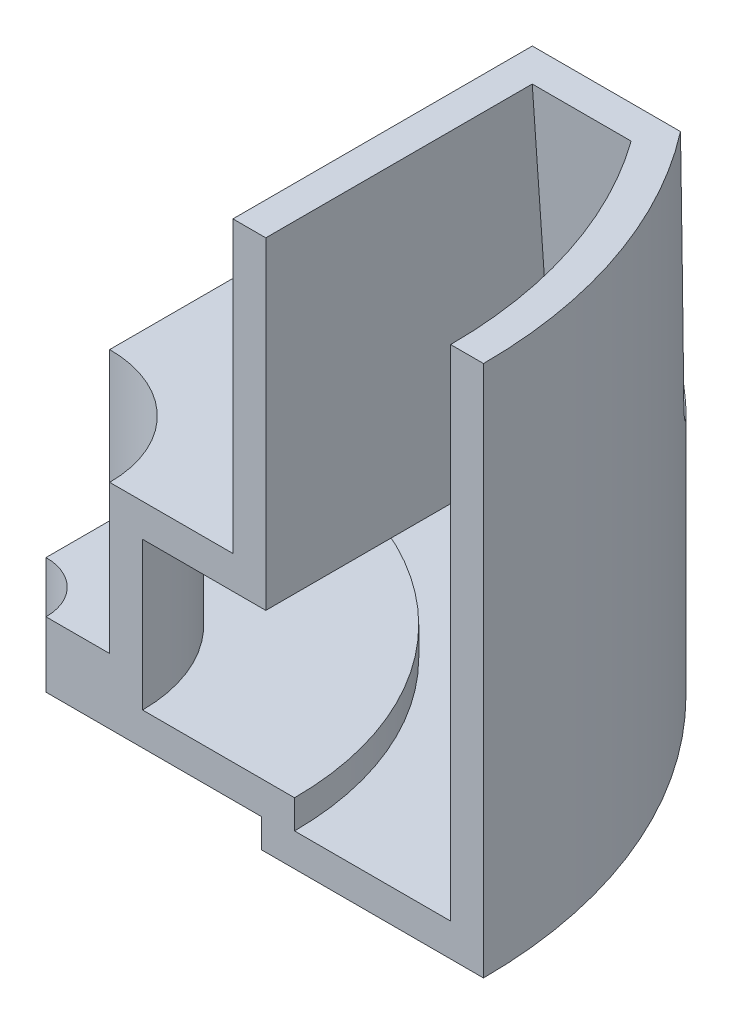
ISO-10303-21;
HEADER;
FILE_DESCRIPTION(('STEP AP214'),'2;1');
FILE_NAME('part.step','',(''),(''),'','','');
FILE_SCHEMA(('AUTOMOTIVE_DESIGN { 1 0 10303 214 1 1 1 1 }'));
ENDSEC;
DATA;
#1=APPLICATION_CONTEXT('core data for automotive mechanical design processes');
#2=APPLICATION_PROTOCOL_DEFINITION('international standard','automotive_design',2000,#1);
#3=PRODUCT_CONTEXT('',#1,'mechanical');
#4=PRODUCT('Part','Part','',(#3));
#5=PRODUCT_RELATED_PRODUCT_CATEGORY('part','',(#4));
#6=PRODUCT_DEFINITION_FORMATION('','',#4);
#7=PRODUCT_DEFINITION_CONTEXT('part definition',#1,'design');
#8=PRODUCT_DEFINITION('design','',#6,#7);
#9=PRODUCT_DEFINITION_SHAPE('','',#8);
#10=(LENGTH_UNIT() NAMED_UNIT(*) SI_UNIT(.MILLI.,.METRE.));
#11=(NAMED_UNIT(*) PLANE_ANGLE_UNIT() SI_UNIT($,.RADIAN.));
#12=(NAMED_UNIT(*) SI_UNIT($,.STERADIAN.) SOLID_ANGLE_UNIT());
#13=UNCERTAINTY_MEASURE_WITH_UNIT(LENGTH_MEASURE(1.E-05),#10,'distance_accuracy_value','');
#14=(GEOMETRIC_REPRESENTATION_CONTEXT(3) GLOBAL_UNCERTAINTY_ASSIGNED_CONTEXT((#13)) GLOBAL_UNIT_ASSIGNED_CONTEXT((#10,
#11,#12)) REPRESENTATION_CONTEXT('',''));
#15=CARTESIAN_POINT('',(0.,0.,0.));
#16=DIRECTION('',(0.,0.,1.));
#17=DIRECTION('',(1.,0.,0.));
#18=AXIS2_PLACEMENT_3D('',#15,#16,#17);
#19=CARTESIAN_POINT('',(0.,129.55,0.));
#20=DIRECTION('',(0.,-1.,0.));
#21=DIRECTION('',(0.,0.,-1.));
#22=AXIS2_PLACEMENT_3D('',#19,#20,#21);
#23=PLANE('',#22);
#24=DIRECTION('',(1.,0.,0.));
#25=VECTOR('',#24,1.);
#26=CARTESIAN_POINT('',(119.001,129.55,-64.866525196679));
#27=LINE('',#26,#25);
#28=CARTESIAN_POINT('',(66.,129.55,-64.866525196679));
#29=VERTEX_POINT('',#28);
#30=CARTESIAN_POINT('',(90.074046810991,129.55,-64.866525196679));
#31=VERTEX_POINT('',#30);
#32=EDGE_CURVE('E46',#29,#31,#27,.T.);
#33=ORIENTED_EDGE('',*,*,#32,.T.);
#34=CARTESIAN_POINT('',(0.,129.55,0.));
#35=DIRECTION('',(0.,-1.,0.));
#36=DIRECTION('',(0.,0.,-1.));
#37=AXIS2_PLACEMENT_3D('',#34,#35,#36);
#38=CIRCLE('',#37,111.);
#39=CARTESIAN_POINT('',(111.,129.55,0.));
#40=VERTEX_POINT('',#39);
#41=EDGE_CURVE('E11',#31,#40,#38,.T.);
#42=ORIENTED_EDGE('',*,*,#41,.T.);
#43=DIRECTION('',(1.,0.,0.));
#44=VECTOR('',#43,1.);
#45=CARTESIAN_POINT('',(0.,129.55,0.));
#46=LINE('',#45,#44);
#47=CARTESIAN_POINT('',(119.,129.55,0.));
#48=VERTEX_POINT('',#47);
#49=EDGE_CURVE('E59',#40,#48,#46,.T.);
#50=ORIENTED_EDGE('',*,*,#49,.T.);
#51=CARTESIAN_POINT('',(0.,129.55,0.));
#52=DIRECTION('',(0.,-1.,0.));
#53=DIRECTION('',(0.,0.,-1.));
#54=AXIS2_PLACEMENT_3D('',#51,#52,#53);
#55=CIRCLE('',#54,119.);
#56=CARTESIAN_POINT('',(94.0671154128229,129.55,-72.8860603813284));
#57=VERTEX_POINT('',#56);
#58=EDGE_CURVE('E315',#57,#48,#55,.T.);
#59=ORIENTED_EDGE('',*,*,#58,.F.);
#60=DIRECTION('',(1.,0.,0.));
#61=VECTOR('',#60,1.);
#62=CARTESIAN_POINT('',(119.001,129.55,-72.8860603813284));
#63=LINE('',#62,#61);
#64=CARTESIAN_POINT('',(58.,129.55,-72.8860603813284));
#65=VERTEX_POINT('',#64);
#66=EDGE_CURVE('E311',#65,#57,#63,.T.);
#67=ORIENTED_EDGE('',*,*,#66,.F.);
#68=DIRECTION('',(0.,0.,-1.));
#69=VECTOR('',#68,1.);
#70=CARTESIAN_POINT('',(58.,129.55,0.));
#71=LINE('',#70,#69);
#72=CARTESIAN_POINT('',(58.,129.55,0.));
#73=VERTEX_POINT('',#72);
#74=EDGE_CURVE('E313',#73,#65,#71,.T.);
#75=ORIENTED_EDGE('',*,*,#74,.F.);
#76=CARTESIAN_POINT('',(66.,129.55,0.));
#77=VERTEX_POINT('',#76);
#78=EDGE_CURVE('E317',#73,#77,#46,.T.);
#79=ORIENTED_EDGE('',*,*,#78,.T.);
#80=DIRECTION('',(0.,0.,-1.));
#81=VECTOR('',#80,1.);
#82=CARTESIAN_POINT('',(66.,129.55,0.));
#83=LINE('',#82,#81);
#84=EDGE_CURVE('E51',#77,#29,#83,.T.);
#85=ORIENTED_EDGE('',*,*,#84,.T.);
#86=EDGE_LOOP('',(#33,#42,#50,#59,#67,#75,#79,#85));
#87=FACE_BOUND('',#86,.T.);
#88=ADVANCED_FACE('F43',(#87),#23,.F.);
#89=CARTESIAN_POINT('',(15.5563491861041,12.9,-15.556349186104));
#90=DIRECTION('',(0.,1.,0.));
#91=DIRECTION('',(-1.,0.,0.));
#92=AXIS2_PLACEMENT_3D('',#89,#90,#91);
#93=PLANE('',#92);
#94=CARTESIAN_POINT('',(15.5563491861041,12.9,-15.556349186104));
#95=DIRECTION('',(0.,1.,0.));
#96=DIRECTION('',(-1.,0.,0.));
#97=AXIS2_PLACEMENT_3D('',#94,#95,#96);
#98=CIRCLE('',#97,2.1);
#99=CARTESIAN_POINT('',(13.4563491861041,12.9,-15.556349186104));
#100=VERTEX_POINT('',#99);
#101=EDGE_CURVE('E259',#100,#100,#98,.T.);
#102=ORIENTED_EDGE('',*,*,#101,.T.);
#103=EDGE_LOOP('',(#102));
#104=FACE_BOUND('',#103,.T.);
#105=ADVANCED_FACE('F430',(#104),#93,.T.);
#106=CARTESIAN_POINT('',(15.5563491861041,12.9,-15.556349186104));
#107=DIRECTION('',(0.,1.,0.));
#108=DIRECTION('',(0.,0.,1.));
#109=AXIS2_PLACEMENT_3D('',#106,#107,#108);
#110=CYLINDRICAL_SURFACE('',#109,2.1);
#111=ORIENTED_EDGE('',*,*,#101,.F.);
#112=EDGE_LOOP('',(#111));
#113=FACE_BOUND('',#112,.T.);
#114=CARTESIAN_POINT('',(15.5563491861041,22.9,-15.556349186104));
#115=DIRECTION('',(0.,1.,0.));
#116=DIRECTION('',(-1.,0.,0.));
#117=AXIS2_PLACEMENT_3D('',#114,#115,#116);
#118=CIRCLE('',#117,2.1);
#119=CARTESIAN_POINT('',(13.4563491861041,22.9,-15.556349186104));
#120=VERTEX_POINT('',#119);
#121=EDGE_CURVE('E261',#120,#120,#118,.T.);
#122=ORIENTED_EDGE('',*,*,#121,.T.);
#123=EDGE_LOOP('',(#122));
#124=FACE_BOUND('',#123,.T.);
#125=ADVANCED_FACE('F433',(#113,#124),#110,.F.);
#126=CARTESIAN_POINT('',(0.,22.9,0.));
#127=DIRECTION('',(0.,1.,0.));
#128=DIRECTION('',(0.,0.,1.));
#129=AXIS2_PLACEMENT_3D('',#126,#127,#128);
#130=CYLINDRICAL_SURFACE('',#129,36.);
#131=CARTESIAN_POINT('',(0.,51.,0.));
#132=DIRECTION('',(0.,1.,0.));
#133=DIRECTION('',(0.,0.,1.));
#134=AXIS2_PLACEMENT_3D('',#131,#132,#133);
#135=CIRCLE('',#134,36.);
#136=CARTESIAN_POINT('',(36.,51.,0.));
#137=VERTEX_POINT('',#136);
#138=CARTESIAN_POINT('',(0.,51.,-36.));
#139=VERTEX_POINT('',#138);
#140=EDGE_CURVE('E270',#137,#139,#135,.T.);
#141=ORIENTED_EDGE('',*,*,#140,.F.);
#142=DIRECTION('',(0.,1.,0.));
#143=VECTOR('',#142,1.);
#144=CARTESIAN_POINT('',(36.,22.9,0.));
#145=LINE('',#144,#143);
#146=CARTESIAN_POINT('',(36.,15.,0.));
#147=VERTEX_POINT('',#146);
#148=EDGE_CURVE('E401',#137,#147,#145,.F.);
#149=ORIENTED_EDGE('',*,*,#148,.T.);
#150=CARTESIAN_POINT('',(0.,15.,0.));
#151=DIRECTION('',(0.,-1.,0.));
#152=DIRECTION('',(0.,0.,-1.));
#153=AXIS2_PLACEMENT_3D('',#150,#151,#152);
#154=CIRCLE('',#153,36.);
#155=CARTESIAN_POINT('',(0.,15.,-36.));
#156=VERTEX_POINT('',#155);
#157=EDGE_CURVE('E221',#147,#156,#154,.F.);
#158=ORIENTED_EDGE('',*,*,#157,.T.);
#159=DIRECTION('',(0.,1.,0.));
#160=VECTOR('',#159,1.);
#161=CARTESIAN_POINT('',(0.,22.9,-36.));
#162=LINE('',#161,#160);
#163=EDGE_CURVE('E203',#139,#156,#162,.F.);
#164=ORIENTED_EDGE('',*,*,#163,.F.);
#165=EDGE_LOOP('',(#141,#149,#158,#164));
#166=FACE_BOUND('',#165,.T.);
#167=ADVANCED_FACE('F437',(#166),#130,.T.);
#168=CARTESIAN_POINT('',(0.,15.,0.));
#169=DIRECTION('',(0.,-1.,0.));
#170=DIRECTION('',(0.,0.,-1.));
#171=AXIS2_PLACEMENT_3D('',#168,#169,#170);
#172=PLANE('',#171);
#173=DIRECTION('',(-1.,0.,0.));
#174=VECTOR('',#173,1.);
#175=CARTESIAN_POINT('',(0.,15.,0.));
#176=LINE('',#175,#174);
#177=CARTESIAN_POINT('',(73.,15.,0.));
#178=VERTEX_POINT('',#177);
#179=EDGE_CURVE('E219',#178,#147,#176,.T.);
#180=ORIENTED_EDGE('',*,*,#179,.F.);
#181=CARTESIAN_POINT('',(0.,15.,0.));
#182=DIRECTION('',(0.,-1.,0.));
#183=DIRECTION('',(0.,0.,-1.));
#184=AXIS2_PLACEMENT_3D('',#181,#182,#183);
#185=CIRCLE('',#184,73.);
#186=CARTESIAN_POINT('',(0.,15.,-73.));
#187=VERTEX_POINT('',#186);
#188=EDGE_CURVE('E198',#187,#178,#185,.T.);
#189=ORIENTED_EDGE('',*,*,#188,.F.);
#190=DIRECTION('',(0.,0.,1.));
#191=VECTOR('',#190,1.);
#192=CARTESIAN_POINT('',(0.,15.,0.));
#193=LINE('',#192,#191);
#194=EDGE_CURVE('E206',#187,#156,#193,.T.);
#195=ORIENTED_EDGE('',*,*,#194,.T.);
#196=ORIENTED_EDGE('',*,*,#157,.F.);
#197=EDGE_LOOP('',(#180,#189,#195,#196));
#198=FACE_BOUND('',#197,.T.);
#199=ADVANCED_FACE('F217',(#198),#172,.F.);
#200=CARTESIAN_POINT('',(0.,7.,0.));
#201=DIRECTION('',(0.,-1.,0.));
#202=DIRECTION('',(0.,0.,-1.));
#203=AXIS2_PLACEMENT_3D('',#200,#201,#202);
#204=CYLINDRICAL_SURFACE('',#203,73.);
#205=ORIENTED_EDGE('',*,*,#188,.T.);
#206=DIRECTION('',(0.,-1.,0.));
#207=VECTOR('',#206,1.);
#208=CARTESIAN_POINT('',(73.,7.,0.));
#209=LINE('',#208,#207);
#210=CARTESIAN_POINT('',(73.,8.,0.));
#211=VERTEX_POINT('',#210);
#212=EDGE_CURVE('E338',#178,#211,#209,.T.);
#213=ORIENTED_EDGE('',*,*,#212,.T.);
#214=CARTESIAN_POINT('',(0.,8.,0.));
#215=DIRECTION('',(0.,1.,0.));
#216=DIRECTION('',(0.,0.,1.));
#217=AXIS2_PLACEMENT_3D('',#214,#215,#216);
#218=CIRCLE('',#217,73.);
#219=CARTESIAN_POINT('',(0.,8.,-73.));
#220=VERTEX_POINT('',#219);
#221=EDGE_CURVE('E200',#220,#211,#218,.F.);
#222=ORIENTED_EDGE('',*,*,#221,.F.);
#223=DIRECTION('',(0.,-1.,0.));
#224=VECTOR('',#223,1.);
#225=CARTESIAN_POINT('',(0.,7.,-73.));
#226=LINE('',#225,#224);
#227=EDGE_CURVE('E194',#187,#220,#226,.T.);
#228=ORIENTED_EDGE('',*,*,#227,.F.);
#229=EDGE_LOOP('',(#205,#213,#222,#228));
#230=FACE_BOUND('',#229,.T.);
#231=ADVANCED_FACE('F196',(#230),#204,.T.);
#232=CARTESIAN_POINT('',(0.,7.,0.));
#233=DIRECTION('',(0.,-1.,0.));
#234=DIRECTION('',(0.,0.,-1.));
#235=AXIS2_PLACEMENT_3D('',#232,#233,#234);
#236=CYLINDRICAL_SURFACE('',#235,65.);
#237=DIRECTION('',(0.,-1.,0.));
#238=VECTOR('',#237,1.);
#239=CARTESIAN_POINT('',(65.,7.,0.));
#240=LINE('',#239,#238);
#241=CARTESIAN_POINT('',(65.,7.,0.));
#242=VERTEX_POINT('',#241);
#243=CARTESIAN_POINT('',(65.,0.,0.));
#244=VERTEX_POINT('',#243);
#245=EDGE_CURVE('E295',#242,#244,#240,.T.);
#246=ORIENTED_EDGE('',*,*,#245,.F.);
#247=CARTESIAN_POINT('',(0.,7.,0.));
#248=DIRECTION('',(0.,-1.,0.));
#249=DIRECTION('',(0.,0.,-1.));
#250=AXIS2_PLACEMENT_3D('',#247,#248,#249);
#251=CIRCLE('',#250,65.);
#252=CARTESIAN_POINT('',(0.,7.,-65.));
#253=VERTEX_POINT('',#252);
#254=EDGE_CURVE('E239',#253,#242,#251,.T.);
#255=ORIENTED_EDGE('',*,*,#254,.F.);
#256=DIRECTION('',(0.,-1.,0.));
#257=VECTOR('',#256,1.);
#258=CARTESIAN_POINT('',(0.,7.,-65.));
#259=LINE('',#258,#257);
#260=CARTESIAN_POINT('',(0.,0.,-65.));
#261=VERTEX_POINT('',#260);
#262=EDGE_CURVE('E391',#253,#261,#259,.T.);
#263=ORIENTED_EDGE('',*,*,#262,.T.);
#264=CARTESIAN_POINT('',(0.,0.,0.));
#265=DIRECTION('',(0.,-1.,0.));
#266=DIRECTION('',(0.,0.,-1.));
#267=AXIS2_PLACEMENT_3D('',#264,#265,#266);
#268=CIRCLE('',#267,65.);
#269=EDGE_CURVE('E224',#261,#244,#268,.T.);
#270=ORIENTED_EDGE('',*,*,#269,.T.);
#271=EDGE_LOOP('',(#246,#255,#263,#270));
#272=FACE_BOUND('',#271,.T.);
#273=ADVANCED_FACE('F490',(#272),#236,.F.);
#274=CARTESIAN_POINT('',(0.,7.,0.));
#275=DIRECTION('',(0.,-1.,0.));
#276=DIRECTION('',(0.,0.,-1.));
#277=AXIS2_PLACEMENT_3D('',#274,#275,#276);
#278=PLANE('',#277);
#279=ORIENTED_EDGE('',*,*,#254,.T.);
#280=DIRECTION('',(-1.,0.,0.));
#281=VECTOR('',#280,1.);
#282=CARTESIAN_POINT('',(0.,7.,0.));
#283=LINE('',#282,#281);
#284=CARTESIAN_POINT('',(12.5,7.00000000000001,0.));
#285=VERTEX_POINT('',#284);
#286=EDGE_CURVE('E392',#242,#285,#283,.T.);
#287=ORIENTED_EDGE('',*,*,#286,.T.);
#288=CARTESIAN_POINT('',(0.,7.00000000000001,0.));
#289=DIRECTION('',(0.,-1.,0.));
#290=DIRECTION('',(0.,0.,-1.));
#291=AXIS2_PLACEMENT_3D('',#288,#289,#290);
#292=CIRCLE('',#291,12.5);
#293=CARTESIAN_POINT('',(0.,7.00000000000001,-12.5));
#294=VERTEX_POINT('',#293);
#295=EDGE_CURVE('E241',#285,#294,#292,.F.);
#296=ORIENTED_EDGE('',*,*,#295,.T.);
#297=DIRECTION('',(0.,0.,1.));
#298=VECTOR('',#297,1.);
#299=CARTESIAN_POINT('',(0.,7.,0.));
#300=LINE('',#299,#298);
#301=EDGE_CURVE('E287',#253,#294,#300,.T.);
#302=ORIENTED_EDGE('',*,*,#301,.F.);
#303=EDGE_LOOP('',(#279,#287,#296,#302));
#304=FACE_BOUND('',#303,.T.);
#305=ADVANCED_FACE('F498',(#304),#278,.T.);
#306=CARTESIAN_POINT('',(0.,259.1,0.));
#307=DIRECTION('',(0.,-1.,0.));
#308=DIRECTION('',(0.,0.,-1.));
#309=AXIS2_PLACEMENT_3D('',#306,#307,#308);
#310=CYLINDRICAL_SURFACE('',#309,12.5);
#311=DIRECTION('',(0.,-1.,0.));
#312=VECTOR('',#311,1.);
#313=CARTESIAN_POINT('',(12.5,259.1,0.));
#314=LINE('',#313,#312);
#315=CARTESIAN_POINT('',(12.5,22.9,0.));
#316=VERTEX_POINT('',#315);
#317=EDGE_CURVE('E281',#316,#285,#314,.T.);
#318=ORIENTED_EDGE('',*,*,#317,.F.);
#319=CARTESIAN_POINT('',(0.,22.9,0.));
#320=DIRECTION('',(0.,1.,0.));
#321=DIRECTION('',(0.,0.,1.));
#322=AXIS2_PLACEMENT_3D('',#319,#320,#321);
#323=CIRCLE('',#322,12.5);
#324=CARTESIAN_POINT('',(0.,22.9,-12.5));
#325=VERTEX_POINT('',#324);
#326=EDGE_CURVE('E250',#325,#316,#323,.F.);
#327=ORIENTED_EDGE('',*,*,#326,.F.);
#328=DIRECTION('',(0.,-1.,0.));
#329=VECTOR('',#328,1.);
#330=CARTESIAN_POINT('',(0.,259.1,-12.5));
#331=LINE('',#330,#329);
#332=EDGE_CURVE('E382',#325,#294,#331,.T.);
#333=ORIENTED_EDGE('',*,*,#332,.T.);
#334=ORIENTED_EDGE('',*,*,#295,.F.);
#335=EDGE_LOOP('',(#318,#327,#333,#334));
#336=FACE_BOUND('',#335,.T.);
#337=ADVANCED_FACE('F507',(#336),#310,.F.);
#338=CARTESIAN_POINT('',(0.,22.9,0.));
#339=DIRECTION('',(0.,1.,0.));
#340=DIRECTION('',(0.,0.,1.));
#341=AXIS2_PLACEMENT_3D('',#338,#339,#340);
#342=PLANE('',#341);
#343=ORIENTED_EDGE('',*,*,#121,.F.);
#344=EDGE_LOOP('',(#343));
#345=FACE_BOUND('',#344,.T.);
#346=ORIENTED_EDGE('',*,*,#326,.T.);
#347=DIRECTION('',(1.,0.,0.));
#348=VECTOR('',#347,1.);
#349=CARTESIAN_POINT('',(0.,22.9,0.));
#350=LINE('',#349,#348);
#351=CARTESIAN_POINT('',(28.,22.9,0.));
#352=VERTEX_POINT('',#351);
#353=EDGE_CURVE('E389',#316,#352,#350,.T.);
#354=ORIENTED_EDGE('',*,*,#353,.T.);
#355=CARTESIAN_POINT('',(0.,22.9,0.));
#356=DIRECTION('',(0.,1.,0.));
#357=DIRECTION('',(0.,0.,1.));
#358=AXIS2_PLACEMENT_3D('',#355,#356,#357);
#359=CIRCLE('',#358,28.);
#360=CARTESIAN_POINT('',(0.,22.9,-28.));
#361=VERTEX_POINT('',#360);
#362=EDGE_CURVE('E253',#352,#361,#359,.T.);
#363=ORIENTED_EDGE('',*,*,#362,.T.);
#364=DIRECTION('',(0.,0.,-1.));
#365=VECTOR('',#364,1.);
#366=CARTESIAN_POINT('',(0.,22.9,0.));
#367=LINE('',#366,#365);
#368=EDGE_CURVE('E284',#325,#361,#367,.T.);
#369=ORIENTED_EDGE('',*,*,#368,.F.);
#370=EDGE_LOOP('',(#346,#354,#363,#369));
#371=FACE_BOUND('',#370,.T.);
#372=ADVANCED_FACE('F516',(#345,#371),#342,.T.);
#373=CARTESIAN_POINT('',(0.,22.9,0.));
#374=DIRECTION('',(0.,1.,0.));
#375=DIRECTION('',(0.,0.,1.));
#376=AXIS2_PLACEMENT_3D('',#373,#374,#375);
#377=CYLINDRICAL_SURFACE('',#376,28.);
#378=DIRECTION('',(0.,1.,0.));
#379=VECTOR('',#378,1.);
#380=CARTESIAN_POINT('',(28.,22.9,0.));
#381=LINE('',#380,#379);
#382=CARTESIAN_POINT('',(28.,59.,0.));
#383=VERTEX_POINT('',#382);
#384=EDGE_CURVE('E292',#383,#352,#381,.F.);
#385=ORIENTED_EDGE('',*,*,#384,.F.);
#386=CARTESIAN_POINT('',(0.,59.,0.));
#387=DIRECTION('',(0.,1.,0.));
#388=DIRECTION('',(0.,0.,1.));
#389=AXIS2_PLACEMENT_3D('',#386,#387,#388);
#390=CIRCLE('',#389,28.);
#391=CARTESIAN_POINT('',(0.,59.,-28.));
#392=VERTEX_POINT('',#391);
#393=EDGE_CURVE('E256',#383,#392,#390,.T.);
#394=ORIENTED_EDGE('',*,*,#393,.T.);
#395=DIRECTION('',(0.,1.,0.));
#396=VECTOR('',#395,1.);
#397=CARTESIAN_POINT('',(0.,22.9,-28.));
#398=LINE('',#397,#396);
#399=EDGE_CURVE('E390',#392,#361,#398,.F.);
#400=ORIENTED_EDGE('',*,*,#399,.T.);
#401=ORIENTED_EDGE('',*,*,#362,.F.);
#402=EDGE_LOOP('',(#385,#394,#400,#401));
#403=FACE_BOUND('',#402,.T.);
#404=ADVANCED_FACE('F525',(#403),#377,.F.);
#405=CARTESIAN_POINT('',(0.,8.,0.));
#406=DIRECTION('',(0.,1.,0.));
#407=DIRECTION('',(0.,0.,1.));
#408=AXIS2_PLACEMENT_3D('',#405,#406,#407);
#409=PLANE('',#408);
#410=ORIENTED_EDGE('',*,*,#221,.T.);
#411=DIRECTION('',(1.,0.,0.));
#412=VECTOR('',#411,1.);
#413=CARTESIAN_POINT('',(0.,8.,0.));
#414=LINE('',#413,#412);
#415=CARTESIAN_POINT('',(111.,8.,0.));
#416=VERTEX_POINT('',#415);
#417=EDGE_CURVE('E403',#211,#416,#414,.T.);
#418=ORIENTED_EDGE('',*,*,#417,.T.);
#419=CARTESIAN_POINT('',(0.,8.,0.));
#420=DIRECTION('',(0.,1.,0.));
#421=DIRECTION('',(0.,0.,1.));
#422=AXIS2_PLACEMENT_3D('',#419,#420,#421);
#423=CIRCLE('',#422,111.);
#424=CARTESIAN_POINT('',(0.,8.,-111.));
#425=VERTEX_POINT('',#424);
#426=EDGE_CURVE('E265',#416,#425,#423,.T.);
#427=ORIENTED_EDGE('',*,*,#426,.T.);
#428=DIRECTION('',(0.,0.,-1.));
#429=VECTOR('',#428,1.);
#430=CARTESIAN_POINT('',(0.,8.,0.));
#431=LINE('',#430,#429);
#432=EDGE_CURVE('E308',#220,#425,#431,.T.);
#433=ORIENTED_EDGE('',*,*,#432,.F.);
#434=EDGE_LOOP('',(#410,#418,#427,#433));
#435=FACE_BOUND('',#434,.T.);
#436=ADVANCED_FACE('F445',(#435),#409,.T.);
#437=CARTESIAN_POINT('',(0.,0.,0.));
#438=DIRECTION('',(1.,0.,0.));
#439=DIRECTION('',(0.,0.,-1.));
#440=AXIS2_PLACEMENT_3D('',#437,#438,#439);
#441=PLANE('',#440);
#442=ORIENTED_EDGE('',*,*,#163,.T.);
#443=ORIENTED_EDGE('',*,*,#194,.F.);
#444=ORIENTED_EDGE('',*,*,#227,.T.);
#445=ORIENTED_EDGE('',*,*,#432,.T.);
#446=DIRECTION('',(0.,-1.,0.));
#447=VECTOR('',#446,1.);
#448=CARTESIAN_POINT('',(0.,59.,-111.));
#449=LINE('',#448,#447);
#450=CARTESIAN_POINT('',(0.,51.,-111.));
#451=VERTEX_POINT('',#450);
#452=EDGE_CURVE('E305',#425,#451,#449,.F.);
#453=ORIENTED_EDGE('',*,*,#452,.T.);
#454=DIRECTION('',(0.,0.,-1.));
#455=VECTOR('',#454,1.);
#456=CARTESIAN_POINT('',(0.,51.,0.));
#457=LINE('',#456,#455);
#458=EDGE_CURVE('E213',#139,#451,#457,.T.);
#459=ORIENTED_EDGE('',*,*,#458,.F.);
#460=EDGE_LOOP('',(#442,#443,#444,#445,#453,#459));
#461=FACE_BOUND('',#460,.T.);
#462=ORIENTED_EDGE('',*,*,#301,.T.);
#463=ORIENTED_EDGE('',*,*,#332,.F.);
#464=ORIENTED_EDGE('',*,*,#368,.T.);
#465=ORIENTED_EDGE('',*,*,#399,.F.);
#466=DIRECTION('',(0.,0.,-1.));
#467=VECTOR('',#466,1.);
#468=CARTESIAN_POINT('',(0.,59.,0.));
#469=LINE('',#468,#467);
#470=CARTESIAN_POINT('',(0.,59.,-119.));
#471=VERTEX_POINT('',#470);
#472=EDGE_CURVE('E298',#392,#471,#469,.T.);
#473=ORIENTED_EDGE('',*,*,#472,.T.);
#474=DIRECTION('',(0.,-1.,0.));
#475=VECTOR('',#474,1.);
#476=CARTESIAN_POINT('',(0.,59.,-119.));
#477=LINE('',#476,#475);
#478=CARTESIAN_POINT('',(0.,0.,-119.));
#479=VERTEX_POINT('',#478);
#480=EDGE_CURVE('E277',#479,#471,#477,.F.);
#481=ORIENTED_EDGE('',*,*,#480,.F.);
#482=DIRECTION('',(0.,0.,-1.));
#483=VECTOR('',#482,1.);
#484=CARTESIAN_POINT('',(0.,0.,0.));
#485=LINE('',#484,#483);
#486=EDGE_CURVE('E380',#261,#479,#485,.T.);
#487=ORIENTED_EDGE('',*,*,#486,.F.);
#488=ORIENTED_EDGE('',*,*,#262,.F.);
#489=EDGE_LOOP('',(#462,#463,#464,#465,#473,#481,#487,#488));
#490=FACE_BOUND('',#489,.T.);
#491=ADVANCED_FACE('F207',(#461,#490),#441,.F.);
#492=CARTESIAN_POINT('',(0.,0.,0.));
#493=DIRECTION('',(0.,1.,0.));
#494=DIRECTION('',(0.,0.,1.));
#495=AXIS2_PLACEMENT_3D('',#492,#493,#494);
#496=PLANE('',#495);
#497=DIRECTION('',(1.,0.,0.));
#498=VECTOR('',#497,1.);
#499=CARTESIAN_POINT('',(0.,0.,0.));
#500=LINE('',#499,#498);
#501=CARTESIAN_POINT('',(119.,0.,0.));
#502=VERTEX_POINT('',#501);
#503=EDGE_CURVE('E278',#244,#502,#500,.T.);
#504=ORIENTED_EDGE('',*,*,#503,.F.);
#505=ORIENTED_EDGE('',*,*,#269,.F.);
#506=ORIENTED_EDGE('',*,*,#486,.T.);
#507=CARTESIAN_POINT('',(0.,0.,0.));
#508=DIRECTION('',(0.,1.,0.));
#509=DIRECTION('',(0.,0.,1.));
#510=AXIS2_PLACEMENT_3D('',#507,#508,#509);
#511=CIRCLE('',#510,119.);
#512=EDGE_CURVE('E220',#502,#479,#511,.T.);
#513=ORIENTED_EDGE('',*,*,#512,.F.);
#514=EDGE_LOOP('',(#504,#505,#506,#513));
#515=FACE_BOUND('',#514,.T.);
#516=ADVANCED_FACE('F378',(#515),#496,.F.);
#517=CARTESIAN_POINT('',(0.,59.,0.));
#518=DIRECTION('',(0.,1.,0.));
#519=DIRECTION('',(0.,0.,1.));
#520=AXIS2_PLACEMENT_3D('',#517,#518,#519);
#521=PLANE('',#520);
#522=ORIENTED_EDGE('',*,*,#393,.F.);
#523=DIRECTION('',(1.,0.,0.));
#524=VECTOR('',#523,1.);
#525=CARTESIAN_POINT('',(0.,59.,0.));
#526=LINE('',#525,#524);
#527=CARTESIAN_POINT('',(58.,59.,0.));
#528=VERTEX_POINT('',#527);
#529=EDGE_CURVE('E214',#383,#528,#526,.T.);
#530=ORIENTED_EDGE('',*,*,#529,.T.);
#531=DIRECTION('',(0.,0.,-1.));
#532=VECTOR('',#531,1.);
#533=CARTESIAN_POINT('',(58.,59.,63.8931609314753));
#534=LINE('',#533,#532);
#535=CARTESIAN_POINT('',(58.,59.,-87.1445478253195));
#536=VERTEX_POINT('',#535);
#537=EDGE_CURVE('E247',#528,#536,#534,.T.);
#538=ORIENTED_EDGE('',*,*,#537,.T.);
#539=DIRECTION('',(-1.,0.,0.));
#540=VECTOR('',#539,1.);
#541=CARTESIAN_POINT('',(0.,59.,-87.1445478253195));
#542=LINE('',#541,#540);
#543=CARTESIAN_POINT('',(81.035965992395,59.,-87.1445478253195));
#544=VERTEX_POINT('',#543);
#545=EDGE_CURVE('E348',#536,#544,#542,.F.);
#546=ORIENTED_EDGE('',*,*,#545,.T.);
#547=CARTESIAN_POINT('',(0.,59.,0.));
#548=DIRECTION('',(0.,1.,0.));
#549=DIRECTION('',(0.,0.,1.));
#550=AXIS2_PLACEMENT_3D('',#547,#548,#549);
#551=CIRCLE('',#550,119.);
#552=EDGE_CURVE('E242',#544,#471,#551,.T.);
#553=ORIENTED_EDGE('',*,*,#552,.T.);
#554=ORIENTED_EDGE('',*,*,#472,.F.);
#555=EDGE_LOOP('',(#522,#530,#538,#546,#553,#554));
#556=FACE_BOUND('',#555,.T.);
#557=ADVANCED_FACE('F447',(#556),#521,.T.);
#558=CARTESIAN_POINT('',(0.,0.,0.));
#559=DIRECTION('',(0.,0.,1.));
#560=DIRECTION('',(1.,0.,0.));
#561=AXIS2_PLACEMENT_3D('',#558,#559,#560);
#562=PLANE('',#561);
#563=ORIENTED_EDGE('',*,*,#78,.F.);
#564=DIRECTION('',(0.,-1.,0.));
#565=VECTOR('',#564,1.);
#566=CARTESIAN_POINT('',(58.,179.1,0.));
#567=LINE('',#566,#565);
#568=EDGE_CURVE('E290',#73,#528,#567,.T.);
#569=ORIENTED_EDGE('',*,*,#568,.T.);
#570=ORIENTED_EDGE('',*,*,#529,.F.);
#571=ORIENTED_EDGE('',*,*,#384,.T.);
#572=ORIENTED_EDGE('',*,*,#353,.F.);
#573=ORIENTED_EDGE('',*,*,#317,.T.);
#574=ORIENTED_EDGE('',*,*,#286,.F.);
#575=ORIENTED_EDGE('',*,*,#245,.T.);
#576=ORIENTED_EDGE('',*,*,#503,.T.);
#577=DIRECTION('',(0.,-1.,0.));
#578=VECTOR('',#577,1.);
#579=CARTESIAN_POINT('',(119.,59.,0.));
#580=LINE('',#579,#578);
#581=EDGE_CURVE('E275',#502,#48,#580,.F.);
#582=ORIENTED_EDGE('',*,*,#581,.T.);
#583=ORIENTED_EDGE('',*,*,#49,.F.);
#584=DIRECTION('',(0.,-1.,0.));
#585=VECTOR('',#584,1.);
#586=CARTESIAN_POINT('',(111.,59.,0.));
#587=LINE('',#586,#585);
#588=EDGE_CURVE('E395',#416,#40,#587,.F.);
#589=ORIENTED_EDGE('',*,*,#588,.F.);
#590=ORIENTED_EDGE('',*,*,#417,.F.);
#591=ORIENTED_EDGE('',*,*,#212,.F.);
#592=ORIENTED_EDGE('',*,*,#179,.T.);
#593=ORIENTED_EDGE('',*,*,#148,.F.);
#594=DIRECTION('',(1.,0.,0.));
#595=VECTOR('',#594,1.);
#596=CARTESIAN_POINT('',(0.,51.,0.));
#597=LINE('',#596,#595);
#598=CARTESIAN_POINT('',(66.,51.,0.));
#599=VERTEX_POINT('',#598);
#600=EDGE_CURVE('E302',#137,#599,#597,.T.);
#601=ORIENTED_EDGE('',*,*,#600,.T.);
#602=DIRECTION('',(0.,-1.,0.));
#603=VECTOR('',#602,1.);
#604=CARTESIAN_POINT('',(66.,179.1,0.));
#605=LINE('',#604,#603);
#606=EDGE_CURVE('E405',#77,#599,#605,.T.);
#607=ORIENTED_EDGE('',*,*,#606,.F.);
#608=EDGE_LOOP('',(#563,#569,#570,#571,#572,#573,#574,#575,#576,#582,#583,#589,#590,#591,#592,
#593,#601,#607));
#609=FACE_BOUND('',#608,.T.);
#610=ADVANCED_FACE('F373',(#609),#562,.T.);
#611=CARTESIAN_POINT('',(119.001,69.,-87.1445478253195));
#612=DIRECTION('',(-1.,0.,0.));
#613=DIRECTION('',(0.,0.,1.));
#614=AXIS2_PLACEMENT_3D('',#611,#612,#613);
#615=CYLINDRICAL_SURFACE('',#614,10.);
#616=CARTESIAN_POINT('',(81.035965992395,59.,-87.1445478253195));
#617=CARTESIAN_POINT('',(81.2336171195061,59.0000071952574,-86.960752734804));
#618=CARTESIAN_POINT('',(81.430624533456,59.0050672179061,-86.7762993575577));
#619=CARTESIAN_POINT('',(81.8231180384433,59.025564140218,-86.4063081302195));
#620=CARTESIAN_POINT('',(82.0186039405855,59.0410023081761,-86.2207701503277));
#621=CARTESIAN_POINT('',(82.6031330483781,59.1033720520571,-85.6622028442067));
#622=CARTESIAN_POINT('',(82.9894563416311,59.166361085612,-85.2879560894799));
#623=CARTESIAN_POINT('',(83.7560498262989,59.3386077456794,-84.5352938175633));
#624=CARTESIAN_POINT('',(84.1362075476259,59.4483640508094,-84.1568774888004));
#625=CARTESIAN_POINT('',(84.88241180334,59.7172674814716,-83.4041750074622));
#626=CARTESIAN_POINT('',(85.2484724185647,59.8763638055326,-83.0298850149357));
#627=CARTESIAN_POINT('',(85.836783314005,60.1820507358057,-82.4206145641889));
#628=CARTESIAN_POINT('',(86.0642894731275,60.3133228360007,-82.1829829735693));
#629=CARTESIAN_POINT('',(86.5103585874551,60.5989798745708,-81.7132977860374));
#630=CARTESIAN_POINT('',(86.7289204781394,60.7533675539672,-81.4812448544289));
#631=CARTESIAN_POINT('',(87.3672576186838,61.2514355663962,-80.7981879948673));
#632=CARTESIAN_POINT('',(87.7718317341746,61.631104793858,-80.3580548718221));
#633=CARTESIAN_POINT('',(88.4472635501777,62.4040146123025,-79.6133260337798));
#634=CARTESIAN_POINT('',(88.7286033552567,62.7789082540143,-79.2993398555497));
#635=CARTESIAN_POINT('',(89.1154777761538,63.3885239714303,-78.8636140418788));
#636=CARTESIAN_POINT('',(89.2386131077512,63.5996820015469,-78.7242095278181));
#637=CARTESIAN_POINT('',(89.4717967853607,64.0373207810903,-78.4590891901683));
#638=CARTESIAN_POINT('',(89.5818476626002,64.2637985535223,-78.333370719371));
#639=CARTESIAN_POINT('',(89.7702373137747,64.6921686277546,-78.1173572405575));
#640=CARTESIAN_POINT('',(89.8508047070689,64.8918698939945,-78.0246501919323));
#641=CARTESIAN_POINT('',(90.0009578703424,65.3004535642604,-77.851401521635));
#642=CARTESIAN_POINT('',(90.0705457444275,65.5093341993261,-77.7708575691645));
#643=CARTESIAN_POINT('',(90.1978142627192,65.9348916479933,-77.6232169005572));
#644=CARTESIAN_POINT('',(90.2555154044047,66.151554271448,-77.556097041842));
#645=CARTESIAN_POINT('',(90.3583935923667,66.5916379113891,-77.4362120477817));
#646=CARTESIAN_POINT('',(90.4035759937644,66.8150559926003,-77.3834407747462));
#647=CARTESIAN_POINT('',(90.4774977969022,67.2478322998897,-77.2969948270973));
#648=CARTESIAN_POINT('',(90.507313333106,67.4567578693898,-77.2620725259133));
#649=CARTESIAN_POINT('',(90.5556127819799,67.8776461462228,-77.2054541155256));
#650=CARTESIAN_POINT('',(90.5740986553624,68.089608321539,-77.1837557177955));
#651=CARTESIAN_POINT('',(90.5867525779419,68.3024352625588,-77.1689073227213));
#652=B_SPLINE_CURVE_WITH_KNOTS('',3,(#616,#617,#618,#619,#620,#621,#622,#623,#624,#625,#626,
#627,#628,#629,#630,#631,#632,#633,#634,#635,#636,#637,#638,#639,#640,#641,#642,#643,#644,#645,
#646,#647,#648,#649,#650,#651),.UNSPECIFIED.,.F.,.F.,(4,2,2,2,2,2,2,2,2,2,2,2,2,2,2,2,2,4),(0.,
0.809602339473507,1.61930363701745,3.24193904719791,4.88232749721273,6.52103254659718,
7.58278418448273,8.64466182362355,10.7586683407754,12.4442104928153,13.2875102257485,
14.1306465534268,14.8333005013834,15.5358196293423,16.2371170013565,16.9381139157338,
17.5791311363493,18.2200373911185),.UNSPECIFIED.);
#653=CARTESIAN_POINT('',(90.5867525779419,68.3024352625583,-77.1689073227213));
#654=VERTEX_POINT('',#653);
#655=EDGE_CURVE('E230',#544,#654,#652,.T.);
#656=ORIENTED_EDGE('',*,*,#655,.F.);
#657=ORIENTED_EDGE('',*,*,#545,.F.);
#658=CARTESIAN_POINT('',(58.,69.,-87.1445478253195));
#659=DIRECTION('',(1.,0.,0.));
#660=DIRECTION('',(0.,0.,-1.));
#661=AXIS2_PLACEMENT_3D('',#658,#659,#660);
#662=CIRCLE('',#661,10.);
#663=CARTESIAN_POINT('',(58.,68.3024352625588,-77.1689073227213));
#664=VERTEX_POINT('',#663);
#665=EDGE_CURVE('E349',#664,#536,#662,.T.);
#666=ORIENTED_EDGE('',*,*,#665,.F.);
#667=DIRECTION('',(-1.,0.,0.));
#668=VECTOR('',#667,1.);
#669=CARTESIAN_POINT('',(119.001,68.3024352625588,-77.1689073227213));
#670=LINE('',#669,#668);
#671=EDGE_CURVE('E245',#654,#664,#670,.T.);
#672=ORIENTED_EDGE('',*,*,#671,.F.);
#673=EDGE_LOOP('',(#656,#657,#666,#672));
#674=FACE_BOUND('',#673,.T.);
#675=ADVANCED_FACE('F363',(#674),#615,.F.);
#676=CARTESIAN_POINT('',(0.,59.,0.));
#677=DIRECTION('',(0.,-1.,0.));
#678=DIRECTION('',(0.,0.,-1.));
#679=AXIS2_PLACEMENT_3D('',#676,#677,#678);
#680=CYLINDRICAL_SURFACE('',#679,119.);
#681=CARTESIAN_POINT('',(0.,1171.86922427998,0.));
#682=DIRECTION('',(0.,-0.069756473744122,0.997564050259824));
#683=DIRECTION('',(0.,-0.997564050259825,-0.0697564737441221));
#684=AXIS2_PLACEMENT_3D('',#681,#682,#683);
#685=ELLIPSE('',#684,1705.93485611832,119.);
#686=EDGE_CURVE('E246',#57,#654,#685,.F.);
#687=ORIENTED_EDGE('',*,*,#686,.F.);
#688=ORIENTED_EDGE('',*,*,#58,.T.);
#689=ORIENTED_EDGE('',*,*,#581,.F.);
#690=ORIENTED_EDGE('',*,*,#512,.T.);
#691=ORIENTED_EDGE('',*,*,#480,.T.);
#692=ORIENTED_EDGE('',*,*,#552,.F.);
#693=ORIENTED_EDGE('',*,*,#655,.T.);
#694=EDGE_LOOP('',(#687,#688,#689,#690,#691,#692,#693));
#695=FACE_BOUND('',#694,.T.);
#696=ADVANCED_FACE('F361',(#695),#680,.T.);
#697=CARTESIAN_POINT('',(58.,179.1,0.));
#698=DIRECTION('',(1.,0.,0.));
#699=DIRECTION('',(0.,0.,-1.));
#700=AXIS2_PLACEMENT_3D('',#697,#698,#699);
#701=PLANE('',#700);
#702=ORIENTED_EDGE('',*,*,#568,.F.);
#703=ORIENTED_EDGE('',*,*,#74,.T.);
#704=DIRECTION('',(0.,0.997564050259824,0.069756473744122));
#705=VECTOR('',#704,1.);
#706=CARTESIAN_POINT('',(58.,59.,-77.8193969639428));
#707=LINE('',#706,#705);
#708=EDGE_CURVE('E249',#664,#65,#707,.T.);
#709=ORIENTED_EDGE('',*,*,#708,.F.);
#710=ORIENTED_EDGE('',*,*,#665,.T.);
#711=ORIENTED_EDGE('',*,*,#537,.F.);
#712=EDGE_LOOP('',(#702,#703,#709,#710,#711));
#713=FACE_BOUND('',#712,.T.);
#714=ADVANCED_FACE('F367',(#713),#701,.F.);
#715=CARTESIAN_POINT('',(119.001,59.,-77.8193969639428));
#716=DIRECTION('',(0.,-0.069756473744122,0.997564050259824));
#717=DIRECTION('',(0.,-0.997564050259825,-0.0697564737441221));
#718=AXIS2_PLACEMENT_3D('',#715,#716,#717);
#719=PLANE('',#718);
#720=ORIENTED_EDGE('',*,*,#708,.T.);
#721=ORIENTED_EDGE('',*,*,#66,.T.);
#722=ORIENTED_EDGE('',*,*,#686,.T.);
#723=ORIENTED_EDGE('',*,*,#671,.T.);
#724=EDGE_LOOP('',(#720,#721,#722,#723));
#725=FACE_BOUND('',#724,.T.);
#726=ADVANCED_FACE('F365',(#725),#719,.F.);
#727=CARTESIAN_POINT('',(0.,51.,0.));
#728=DIRECTION('',(0.,1.,0.));
#729=DIRECTION('',(0.,0.,1.));
#730=AXIS2_PLACEMENT_3D('',#727,#728,#729);
#731=PLANE('',#730);
#732=ORIENTED_EDGE('',*,*,#600,.F.);
#733=ORIENTED_EDGE('',*,*,#140,.T.);
#734=ORIENTED_EDGE('',*,*,#458,.T.);
#735=CARTESIAN_POINT('',(0.,51.,0.));
#736=DIRECTION('',(0.,1.,0.));
#737=DIRECTION('',(0.,0.,1.));
#738=AXIS2_PLACEMENT_3D('',#735,#736,#737);
#739=CIRCLE('',#738,111.);
#740=CARTESIAN_POINT('',(68.7519293134425,51.,-87.1445478253195));
#741=VERTEX_POINT('',#740);
#742=EDGE_CURVE('E410',#741,#451,#739,.T.);
#743=ORIENTED_EDGE('',*,*,#742,.F.);
#744=DIRECTION('',(1.,0.,0.));
#745=VECTOR('',#744,1.);
#746=CARTESIAN_POINT('',(0.,51.,-87.1445478253195));
#747=LINE('',#746,#745);
#748=CARTESIAN_POINT('',(66.,51.,-87.1445478253195));
#749=VERTEX_POINT('',#748);
#750=EDGE_CURVE('E264',#749,#741,#747,.T.);
#751=ORIENTED_EDGE('',*,*,#750,.F.);
#752=DIRECTION('',(0.,0.,-1.));
#753=VECTOR('',#752,1.);
#754=CARTESIAN_POINT('',(66.,51.,0.));
#755=LINE('',#754,#753);
#756=EDGE_CURVE('E226',#599,#749,#755,.T.);
#757=ORIENTED_EDGE('',*,*,#756,.F.);
#758=EDGE_LOOP('',(#732,#733,#734,#743,#751,#757));
#759=FACE_BOUND('',#758,.T.);
#760=ADVANCED_FACE('F426',(#759),#731,.F.);
#761=CARTESIAN_POINT('',(119.001,69.,-87.1445478253195));
#762=DIRECTION('',(-1.,0.,0.));
#763=DIRECTION('',(0.,0.,1.));
#764=AXIS2_PLACEMENT_3D('',#761,#762,#763);
#765=CYLINDRICAL_SURFACE('',#764,18.);
#766=CARTESIAN_POINT('',(68.7519293134425,51.,-87.1445478253195));
#767=CARTESIAN_POINT('',(69.1594917196118,51.0000143650253,-86.8230132763634));
#768=CARTESIAN_POINT('',(69.5648136338476,51.0086169979811,-86.4985910340768));
#769=CARTESIAN_POINT('',(70.3704807262659,51.0440221243306,-85.844419825662));
#770=CARTESIAN_POINT('',(70.7708247228197,51.0708288579823,-85.5146696359749));
#771=CARTESIAN_POINT('',(71.5671916904991,51.1437893992038,-84.8493203569711));
#772=CARTESIAN_POINT('',(71.9631955120037,51.1900082141535,-84.5137052805883));
#773=CARTESIAN_POINT('',(72.7487162966171,51.3029045129119,-83.8384927467797));
#774=CARTESIAN_POINT('',(73.1382336903719,51.3695806327675,-83.4988955563054));
#775=CARTESIAN_POINT('',(74.3060193821844,51.6041058242876,-82.4663678463521));
#776=CARTESIAN_POINT('',(75.073445978857,51.8055991008388,-81.7681224358609));
#777=CARTESIAN_POINT('',(76.195876570157,52.1820971673293,-80.7183474579419));
#778=CARTESIAN_POINT('',(76.5650378011771,52.3198756169363,-80.368216785935));
#779=CARTESIAN_POINT('',(77.2929369270787,52.6215811206909,-79.6684153101209));
#780=CARTESIAN_POINT('',(77.6516766225865,52.7855036255364,-79.3187444369582));
#781=CARTESIAN_POINT('',(78.4112761231962,53.167958318264,-78.5684319995568));
#782=CARTESIAN_POINT('',(78.8102257410319,53.3910056094718,-78.1681416320061));
#783=CARTESIAN_POINT('',(79.5904358883232,53.8756841820407,-77.3735903738514));
#784=CARTESIAN_POINT('',(79.9716958971566,54.1373165980532,-76.9793296609346));
#785=CARTESIAN_POINT('',(80.7125008405637,54.6998346111661,-76.2022257675406));
#786=CARTESIAN_POINT('',(81.0721272948094,55.0005573250851,-75.8193428892144));
#787=CARTESIAN_POINT('',(81.7684917106176,55.6434733309974,-75.0678096519375));
#788=CARTESIAN_POINT('',(82.1052339732845,55.9856587961947,-74.6991566241319));
#789=CARTESIAN_POINT('',(82.6978859125289,56.6507565244115,-74.0420222891623));
#790=CARTESIAN_POINT('',(82.9578257216286,56.9671152650248,-73.7505383953635));
#791=CARTESIAN_POINT('',(83.4578555858594,57.6290427003566,-73.1842124806626));
#792=CARTESIAN_POINT('',(83.6979493796504,57.9746058685255,-72.9093673279205));
#793=CARTESIAN_POINT('',(84.1563603728495,58.6946212249738,-72.3797606120091));
#794=CARTESIAN_POINT('',(84.3746720383706,59.0690807119106,-72.1250041559294));
#795=CARTESIAN_POINT('',(84.7873409514429,59.8457098956702,-71.6394328973708));
#796=CARTESIAN_POINT('',(84.9817022559855,60.2478748813688,-71.4086140411142));
#797=CARTESIAN_POINT('',(85.3173282135997,61.0161208286161,-71.0071223832208));
#798=CARTESIAN_POINT('',(85.4621882079619,61.3786318429404,-70.832614094076));
#799=CARTESIAN_POINT('',(85.7318287804352,62.1207866498054,-70.5060166740687));
#800=CARTESIAN_POINT('',(85.8566128313937,62.5004274645583,-70.3539236660703));
#801=CARTESIAN_POINT('',(86.0847881277631,63.2742750626475,-70.0745443742956));
#802=CARTESIAN_POINT('',(86.1882122825866,63.6684583189022,-69.9472199471611));
#803=CARTESIAN_POINT('',(86.3728509505516,64.4693391999034,-69.7190947313896));
#804=CARTESIAN_POINT('',(86.4540741489388,64.876031861367,-69.6182835710708));
#805=CARTESIAN_POINT('',(86.5919055065856,65.6897964769555,-69.446769298598));
#806=CARTESIAN_POINT('',(86.6490391979771,66.0966424094499,-69.3754241595849));
#807=CARTESIAN_POINT('',(86.7178123538622,66.7115640728396,-69.289409924383));
#808=CARTESIAN_POINT('',(86.7379148741101,66.9173020742456,-69.264239891624));
#809=CARTESIAN_POINT('',(86.7724395820179,67.3300083286855,-69.2209827731387));
#810=CARTESIAN_POINT('',(86.7868614174623,67.536976657195,-69.2028961265989));
#811=CARTESIAN_POINT('',(86.7984216924777,67.7443834726053,-69.1883949206427));
#812=B_SPLINE_CURVE_WITH_KNOTS('',3,(#766,#767,#768,#769,#770,#771,#772,#773,#774,#775,#776,
#777,#778,#779,#780,#781,#782,#783,#784,#785,#786,#787,#788,#789,#790,#791,#792,#793,#794,#795,
#796,#797,#798,#799,#800,#801,#802,#803,#804,#805,#806,#807,#808,#809,#810,#811),.UNSPECIFIED.,
.F.,.F.,(4,2,2,2,2,2,2,2,2,2,2,2,2,2,2,2,2,2,2,2,2,2,4),(0.,1.55733291234503,3.11502869673082,
4.67798303326856,6.24083318533589,9.40588947674362,10.9866596655478,12.5671550855483,
14.3884542767181,16.2098070365124,18.0238002072038,19.8374514878782,21.3438904025171,
22.8500448792176,24.3565810348023,25.862861643888,27.1443830452106,28.4256825229787,
29.7049929148365,30.9838021084559,32.2330544892484,32.8576125603983,33.4822093494825),.UNSPECIFIED.);
#813=CARTESIAN_POINT('',(86.7984216924777,67.7443834726053,-69.1883949206427));
#814=VERTEX_POINT('',#813);
#815=EDGE_CURVE('E268',#741,#814,#812,.T.);
#816=ORIENTED_EDGE('',*,*,#815,.T.);
#817=DIRECTION('',(1.,0.,0.));
#818=VECTOR('',#817,1.);
#819=CARTESIAN_POINT('',(119.001,67.7443834726053,-69.1883949206427));
#820=LINE('',#819,#818);
#821=CARTESIAN_POINT('',(66.,67.7443834726053,-69.1883949206427));
#822=VERTEX_POINT('',#821);
#823=EDGE_CURVE('E328',#814,#822,#820,.F.);
#824=ORIENTED_EDGE('',*,*,#823,.T.);
#825=CARTESIAN_POINT('',(66.,69.,-87.1445478253195));
#826=DIRECTION('',(1.,0.,0.));
#827=DIRECTION('',(0.,0.,-1.));
#828=AXIS2_PLACEMENT_3D('',#825,#826,#827);
#829=CIRCLE('',#828,18.);
#830=EDGE_CURVE('E269',#822,#749,#829,.T.);
#831=ORIENTED_EDGE('',*,*,#830,.T.);
#832=ORIENTED_EDGE('',*,*,#750,.T.);
#833=EDGE_LOOP('',(#816,#824,#831,#832));
#834=FACE_BOUND('',#833,.T.);
#835=ADVANCED_FACE('F422',(#834),#765,.T.);
#836=CARTESIAN_POINT('',(119.001,58.441948210047,-69.8388845618642));
#837=DIRECTION('',(0.,-0.069756473744122,0.997564050259824));
#838=DIRECTION('',(0.,-0.997564050259825,-0.0697564737441221));
#839=AXIS2_PLACEMENT_3D('',#836,#837,#838);
#840=PLANE('',#839);
#841=ORIENTED_EDGE('',*,*,#32,.F.);
#842=DIRECTION('',(0.,0.997564050259825,0.0697564737441221));
#843=VECTOR('',#842,1.);
#844=CARTESIAN_POINT('',(66.,58.441948210047,-69.8388845618642));
#845=LINE('',#844,#843);
#846=EDGE_CURVE('E332',#822,#29,#845,.T.);
#847=ORIENTED_EDGE('',*,*,#846,.F.);
#848=ORIENTED_EDGE('',*,*,#823,.F.);
#849=CARTESIAN_POINT('',(0.,1057.18452807035,0.));
#850=DIRECTION('',(0.,-0.069756473744122,0.997564050259824));
#851=DIRECTION('',(0.,-0.997564050259825,-0.0697564737441221));
#852=AXIS2_PLACEMENT_3D('',#849,#850,#851);
#853=ELLIPSE('',#852,1591.25015990868,111.);
#854=EDGE_CURVE('E274',#31,#814,#853,.F.);
#855=ORIENTED_EDGE('',*,*,#854,.F.);
#856=EDGE_LOOP('',(#841,#847,#848,#855));
#857=FACE_BOUND('',#856,.T.);
#858=ADVANCED_FACE('F326',(#857),#840,.T.);
#859=CARTESIAN_POINT('',(0.,59.,0.));
#860=DIRECTION('',(0.,-1.,0.));
#861=DIRECTION('',(0.,0.,-1.));
#862=AXIS2_PLACEMENT_3D('',#859,#860,#861);
#863=CYLINDRICAL_SURFACE('',#862,111.);
#864=ORIENTED_EDGE('',*,*,#41,.F.);
#865=ORIENTED_EDGE('',*,*,#854,.T.);
#866=ORIENTED_EDGE('',*,*,#815,.F.);
#867=ORIENTED_EDGE('',*,*,#742,.T.);
#868=ORIENTED_EDGE('',*,*,#452,.F.);
#869=ORIENTED_EDGE('',*,*,#426,.F.);
#870=ORIENTED_EDGE('',*,*,#588,.T.);
#871=EDGE_LOOP('',(#864,#865,#866,#867,#868,#869,#870));
#872=FACE_BOUND('',#871,.T.);
#873=ADVANCED_FACE('F418',(#872),#863,.F.);
#874=CARTESIAN_POINT('',(66.,179.1,0.));
#875=DIRECTION('',(1.,0.,0.));
#876=DIRECTION('',(0.,0.,-1.));
#877=AXIS2_PLACEMENT_3D('',#874,#875,#876);
#878=PLANE('',#877);
#879=ORIENTED_EDGE('',*,*,#84,.F.);
#880=ORIENTED_EDGE('',*,*,#606,.T.);
#881=ORIENTED_EDGE('',*,*,#756,.T.);
#882=ORIENTED_EDGE('',*,*,#830,.F.);
#883=ORIENTED_EDGE('',*,*,#846,.T.);
#884=EDGE_LOOP('',(#879,#880,#881,#882,#883));
#885=FACE_BOUND('',#884,.T.);
#886=ADVANCED_FACE('F448',(#885),#878,.T.);
#887=CLOSED_SHELL('',(#88,#105,#125,#167,#199,#231,#273,#305,#337,#372,#404,#436,#491,#516,#557,
#610,#675,#696,#714,#726,#760,#835,#858,#873,#886));
#888=MANIFOLD_SOLID_BREP('B2',#887);
#889=ADVANCED_BREP_SHAPE_REPRESENTATION('',(#18,#888),#14);
#890=SHAPE_DEFINITION_REPRESENTATION(#9,#889);
ENDSEC;
END-ISO-10303-21;
